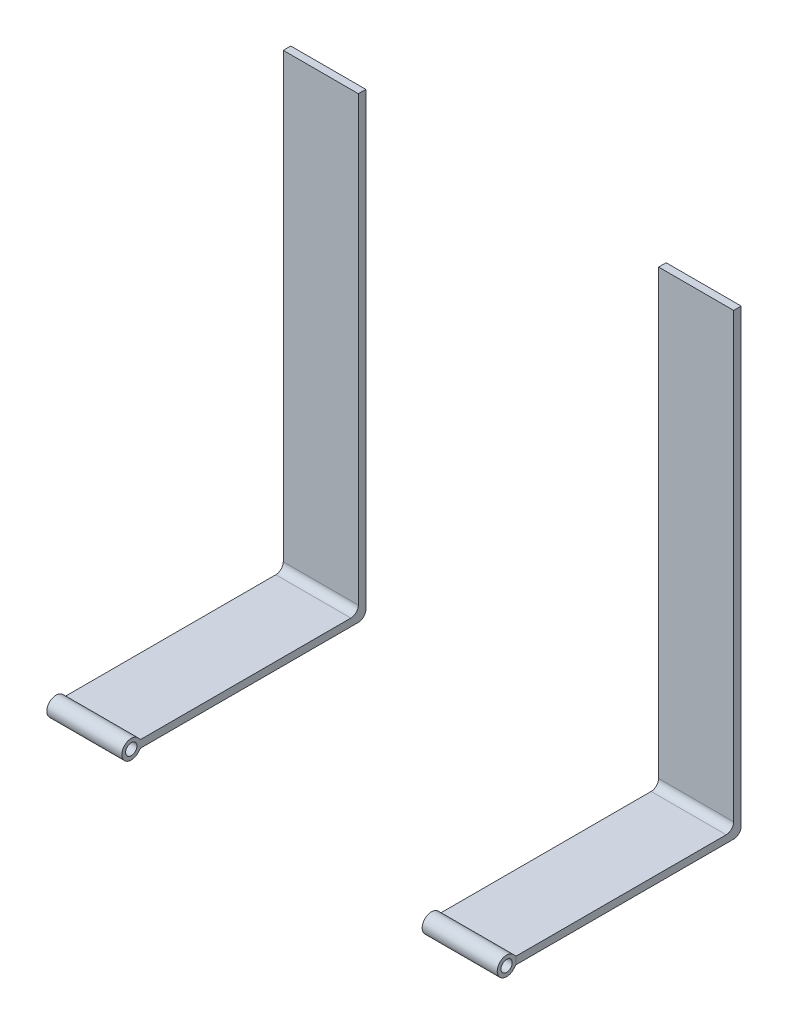
ISO-10303-21;
HEADER;
FILE_DESCRIPTION(('STEP AP214'),'2;1');
FILE_NAME('part.step','',(''),(''),'','','');
FILE_SCHEMA(('AUTOMOTIVE_DESIGN { 1 0 10303 214 1 1 1 1 }'));
ENDSEC;
DATA;
#1=APPLICATION_CONTEXT('core data for automotive mechanical design processes');
#2=APPLICATION_PROTOCOL_DEFINITION('international standard','automotive_design',2000,#1);
#3=PRODUCT_CONTEXT('',#1,'mechanical');
#4=PRODUCT('Part','Part','',(#3));
#5=PRODUCT_RELATED_PRODUCT_CATEGORY('part','',(#4));
#6=PRODUCT_DEFINITION_FORMATION('','',#4);
#7=PRODUCT_DEFINITION_CONTEXT('part definition',#1,'design');
#8=PRODUCT_DEFINITION('design','',#6,#7);
#9=PRODUCT_DEFINITION_SHAPE('','',#8);
#10=(LENGTH_UNIT() NAMED_UNIT(*) SI_UNIT(.MILLI.,.METRE.));
#11=(NAMED_UNIT(*) PLANE_ANGLE_UNIT() SI_UNIT($,.RADIAN.));
#12=(NAMED_UNIT(*) SI_UNIT($,.STERADIAN.) SOLID_ANGLE_UNIT());
#13=UNCERTAINTY_MEASURE_WITH_UNIT(LENGTH_MEASURE(1.E-05),#10,'distance_accuracy_value','');
#14=(GEOMETRIC_REPRESENTATION_CONTEXT(3) GLOBAL_UNCERTAINTY_ASSIGNED_CONTEXT((#13)) GLOBAL_UNIT_ASSIGNED_CONTEXT((#10,
#11,#12)) REPRESENTATION_CONTEXT('',''));
#15=CARTESIAN_POINT('',(0.,0.,0.));
#16=DIRECTION('',(0.,0.,1.));
#17=DIRECTION('',(1.,0.,0.));
#18=AXIS2_PLACEMENT_3D('',#15,#16,#17);
#19=CARTESIAN_POINT('',(-41.8197438789309,1.27,-98.425));
#20=DIRECTION('',(-1.,0.,0.));
#21=DIRECTION('',(0.,0.,1.));
#22=AXIS2_PLACEMENT_3D('',#19,#20,#21);
#23=CYLINDRICAL_SURFACE('',#22,1.90500000000001);
#24=CARTESIAN_POINT('',(-50.8,1.27,-98.425));
#25=DIRECTION('',(-1.,0.,0.));
#26=DIRECTION('',(0.,0.,1.));
#27=AXIS2_PLACEMENT_3D('',#24,#25,#26);
#28=CIRCLE('',#27,1.90500000000001);
#29=CARTESIAN_POINT('',(-50.8,1.27,-96.52));
#30=VERTEX_POINT('',#29);
#31=EDGE_CURVE('E178',#30,#30,#28,.F.);
#32=ORIENTED_EDGE('',*,*,#31,.T.);
#33=EDGE_LOOP('',(#32));
#34=FACE_BOUND('',#33,.T.);
#35=CARTESIAN_POINT('',(-76.2,1.27,-98.425));
#36=DIRECTION('',(-1.,0.,0.));
#37=DIRECTION('',(0.,0.,1.));
#38=AXIS2_PLACEMENT_3D('',#35,#36,#37);
#39=CIRCLE('',#38,1.90500000000001);
#40=CARTESIAN_POINT('',(-76.2,1.27,-96.52));
#41=VERTEX_POINT('',#40);
#42=EDGE_CURVE('E175',#41,#41,#39,.T.);
#43=ORIENTED_EDGE('',*,*,#42,.T.);
#44=EDGE_LOOP('',(#43));
#45=FACE_BOUND('',#44,.T.);
#46=ADVANCED_FACE('F44',(#34,#45),#23,.F.);
#47=CARTESIAN_POINT('',(-41.8197438789308,51.9476813317479,-54.5450653983359));
#48=DIRECTION('',(0.,-0.689655172413789,0.724137931034486));
#49=DIRECTION('',(0.,-0.724137931034486,-0.689655172413789));
#50=AXIS2_PLACEMENT_3D('',#47,#48,#49);
#51=PLANE('',#50);
#52=DIRECTION('',(-1.,0.,0.));
#53=VECTOR('',#52,1.);
#54=CARTESIAN_POINT('',(-41.8197438789308,3.45965517241379,-100.724137931035));
#55=LINE('',#54,#53);
#56=CARTESIAN_POINT('',(-50.8,3.45965517241379,-100.724137931035));
#57=VERTEX_POINT('',#56);
#58=CARTESIAN_POINT('',(-76.2,3.45965517241379,-100.724137931035));
#59=VERTEX_POINT('',#58);
#60=EDGE_CURVE('E48',#57,#59,#55,.T.);
#61=ORIENTED_EDGE('',*,*,#60,.F.);
#62=DIRECTION('',(0.,-0.724137931034486,-0.689655172413789));
#63=VECTOR('',#62,1.);
#64=CARTESIAN_POINT('',(-50.8,51.9476813317479,-54.5450653983359));
#65=LINE('',#64,#63);
#66=CARTESIAN_POINT('',(-50.8,2.54000000000002,-101.6));
#67=VERTEX_POINT('',#66);
#68=EDGE_CURVE('E61',#57,#67,#65,.T.);
#69=ORIENTED_EDGE('',*,*,#68,.T.);
#70=DIRECTION('',(-1.,0.,0.));
#71=VECTOR('',#70,1.);
#72=CARTESIAN_POINT('',(-76.2,2.54,-101.6));
#73=LINE('',#72,#71);
#74=CARTESIAN_POINT('',(-76.2,2.54000000000002,-101.6));
#75=VERTEX_POINT('',#74);
#76=EDGE_CURVE('E172',#67,#75,#73,.T.);
#77=ORIENTED_EDGE('',*,*,#76,.T.);
#78=DIRECTION('',(0.,0.724137931034486,0.689655172413789));
#79=VECTOR('',#78,1.);
#80=CARTESIAN_POINT('',(-76.2,51.9476813317479,-54.5450653983358));
#81=LINE('',#80,#79);
#82=EDGE_CURVE('E168',#75,#59,#81,.T.);
#83=ORIENTED_EDGE('',*,*,#82,.T.);
#84=EDGE_LOOP('',(#61,#69,#77,#83));
#85=FACE_BOUND('',#84,.T.);
#86=ADVANCED_FACE('F46',(#85),#51,.F.);
#87=CARTESIAN_POINT('',(-41.8197438789308,-50.7395957193817,-53.2765755053506));
#88=DIRECTION('',(0.,-0.689655172413794,-0.724137931034482));
#89=DIRECTION('',(0.,0.724137931034482,-0.689655172413794));
#90=AXIS2_PLACEMENT_3D('',#87,#88,#89);
#91=PLANE('',#90);
#92=DIRECTION('',(0.,0.724137931034482,-0.689655172413794));
#93=VECTOR('',#92,1.);
#94=CARTESIAN_POINT('',(-50.8,-50.7395957193817,-53.2765755053506));
#95=LINE('',#94,#93);
#96=CARTESIAN_POINT('',(-50.8,-0.919655172413781,-100.724137931035));
#97=VERTEX_POINT('',#96);
#98=CARTESIAN_POINT('',(-50.8,0.,-101.6));
#99=VERTEX_POINT('',#98);
#100=EDGE_CURVE('E12',#97,#99,#95,.T.);
#101=ORIENTED_EDGE('',*,*,#100,.F.);
#102=DIRECTION('',(-1.,0.,0.));
#103=VECTOR('',#102,1.);
#104=CARTESIAN_POINT('',(-41.8197438789308,-0.919655172413782,-100.724137931035));
#105=LINE('',#104,#103);
#106=CARTESIAN_POINT('',(-76.2,-0.919655172413782,-100.724137931035));
#107=VERTEX_POINT('',#106);
#108=EDGE_CURVE('E171',#97,#107,#105,.T.);
#109=ORIENTED_EDGE('',*,*,#108,.T.);
#110=DIRECTION('',(0.,-0.724137931034482,0.689655172413794));
#111=VECTOR('',#110,1.);
#112=CARTESIAN_POINT('',(-76.2,-50.7395957193817,-53.2765755053506));
#113=LINE('',#112,#111);
#114=CARTESIAN_POINT('',(-76.2,0.,-101.6));
#115=VERTEX_POINT('',#114);
#116=EDGE_CURVE('E129',#115,#107,#113,.T.);
#117=ORIENTED_EDGE('',*,*,#116,.F.);
#118=DIRECTION('',(-1.,0.,0.));
#119=VECTOR('',#118,1.);
#120=CARTESIAN_POINT('',(264.16,0.,-101.6));
#121=LINE('',#120,#119);
#122=EDGE_CURVE('E126',#99,#115,#121,.T.);
#123=ORIENTED_EDGE('',*,*,#122,.F.);
#124=EDGE_LOOP('',(#101,#109,#117,#123));
#125=FACE_BOUND('',#124,.T.);
#126=ADVANCED_FACE('F127',(#125),#91,.T.);
#127=CARTESIAN_POINT('',(-41.8197438789309,1.27,-98.425));
#128=DIRECTION('',(-1.,0.,0.));
#129=DIRECTION('',(0.,0.,1.));
#130=AXIS2_PLACEMENT_3D('',#127,#128,#129);
#131=CYLINDRICAL_SURFACE('',#130,3.175);
#132=ORIENTED_EDGE('',*,*,#108,.F.);
#133=CARTESIAN_POINT('',(-50.8,1.27,-98.425));
#134=DIRECTION('',(-1.,0.,0.));
#135=DIRECTION('',(0.,0.,1.));
#136=AXIS2_PLACEMENT_3D('',#133,#134,#135);
#137=CIRCLE('',#136,3.175);
#138=EDGE_CURVE('E54',#57,#97,#137,.F.);
#139=ORIENTED_EDGE('',*,*,#138,.F.);
#140=ORIENTED_EDGE('',*,*,#60,.T.);
#141=CARTESIAN_POINT('',(-76.2,1.27,-98.425));
#142=DIRECTION('',(-1.,0.,0.));
#143=DIRECTION('',(0.,0.,1.));
#144=AXIS2_PLACEMENT_3D('',#141,#142,#143);
#145=CIRCLE('',#144,3.175);
#146=EDGE_CURVE('E160',#107,#59,#145,.T.);
#147=ORIENTED_EDGE('',*,*,#146,.F.);
#148=EDGE_LOOP('',(#132,#139,#140,#147));
#149=FACE_BOUND('',#148,.T.);
#150=ADVANCED_FACE('F186',(#149),#131,.T.);
#151=CARTESIAN_POINT('',(-50.8,2.54000000000002,-177.8));
#152=DIRECTION('',(-1.,0.,0.));
#153=DIRECTION('',(0.,0.,1.));
#154=AXIS2_PLACEMENT_3D('',#151,#152,#153);
#155=PLANE('',#154);
#156=DIRECTION('',(0.,0.,1.));
#157=VECTOR('',#156,1.);
#158=CARTESIAN_POINT('',(-50.8,2.54000000000002,-177.8));
#159=LINE('',#158,#157);
#160=CARTESIAN_POINT('',(-50.8,2.54000000000002,-172.72));
#161=VERTEX_POINT('',#160);
#162=EDGE_CURVE('E155',#161,#67,#159,.T.);
#163=ORIENTED_EDGE('',*,*,#162,.T.);
#164=ORIENTED_EDGE('',*,*,#68,.F.);
#165=ORIENTED_EDGE('',*,*,#138,.T.);
#166=ORIENTED_EDGE('',*,*,#100,.T.);
#167=DIRECTION('',(0.,0.,1.));
#168=VECTOR('',#167,1.);
#169=CARTESIAN_POINT('',(-50.8,0.,-177.8));
#170=LINE('',#169,#168);
#171=CARTESIAN_POINT('',(-50.8,0.,-175.26));
#172=VERTEX_POINT('',#171);
#173=EDGE_CURVE('E121',#172,#99,#170,.T.);
#174=ORIENTED_EDGE('',*,*,#173,.F.);
#175=CARTESIAN_POINT('',(-50.8,2.54,-175.26));
#176=DIRECTION('',(-1.,0.,0.));
#177=DIRECTION('',(0.,0.,1.));
#178=AXIS2_PLACEMENT_3D('',#175,#176,#177);
#179=CIRCLE('',#178,2.54);
#180=CARTESIAN_POINT('',(-50.8,2.54,-177.8));
#181=VERTEX_POINT('',#180);
#182=EDGE_CURVE('E165',#172,#181,#179,.F.);
#183=ORIENTED_EDGE('',*,*,#182,.T.);
#184=DIRECTION('',(0.,-1.,0.));
#185=VECTOR('',#184,1.);
#186=CARTESIAN_POINT('',(-50.8,2.54000000000002,-177.8));
#187=LINE('',#186,#185);
#188=CARTESIAN_POINT('',(-50.8,154.94,-177.8));
#189=VERTEX_POINT('',#188);
#190=EDGE_CURVE('E159',#189,#181,#187,.T.);
#191=ORIENTED_EDGE('',*,*,#190,.F.);
#192=DIRECTION('',(0.,0.,-1.));
#193=VECTOR('',#192,1.);
#194=CARTESIAN_POINT('',(-50.8,154.94,-177.8));
#195=LINE('',#194,#193);
#196=CARTESIAN_POINT('',(-50.8,154.94,-175.26));
#197=VERTEX_POINT('',#196);
#198=EDGE_CURVE('E225',#197,#189,#195,.T.);
#199=ORIENTED_EDGE('',*,*,#198,.F.);
#200=DIRECTION('',(0.,-1.,0.));
#201=VECTOR('',#200,1.);
#202=CARTESIAN_POINT('',(-50.8,154.94,-175.26));
#203=LINE('',#202,#201);
#204=CARTESIAN_POINT('',(-50.8,5.08000000000006,-175.26));
#205=VERTEX_POINT('',#204);
#206=EDGE_CURVE('E156',#197,#205,#203,.T.);
#207=ORIENTED_EDGE('',*,*,#206,.T.);
#208=CARTESIAN_POINT('',(-50.8,5.08,-172.72));
#209=DIRECTION('',(-1.,0.,0.));
#210=DIRECTION('',(0.,0.,1.));
#211=AXIS2_PLACEMENT_3D('',#208,#209,#210);
#212=CIRCLE('',#211,2.54);
#213=EDGE_CURVE('E153',#205,#161,#212,.T.);
#214=ORIENTED_EDGE('',*,*,#213,.T.);
#215=EDGE_LOOP('',(#163,#164,#165,#166,#174,#183,#191,#199,#207,#214));
#216=FACE_BOUND('',#215,.T.);
#217=ORIENTED_EDGE('',*,*,#31,.F.);
#218=EDGE_LOOP('',(#217));
#219=FACE_BOUND('',#218,.T.);
#220=ADVANCED_FACE('F118',(#216,#219),#155,.F.);
#221=CARTESIAN_POINT('',(0.,2.54,0.));
#222=DIRECTION('',(0.,-1.,0.));
#223=DIRECTION('',(0.,0.,-1.));
#224=AXIS2_PLACEMENT_3D('',#221,#222,#223);
#225=PLANE('',#224);
#226=DIRECTION('',(0.,0.,1.));
#227=VECTOR('',#226,1.);
#228=CARTESIAN_POINT('',(-76.2,2.54000000000002,-177.8));
#229=LINE('',#228,#227);
#230=CARTESIAN_POINT('',(-76.2,2.54000000000002,-172.72));
#231=VERTEX_POINT('',#230);
#232=EDGE_CURVE('E147',#231,#75,#229,.T.);
#233=ORIENTED_EDGE('',*,*,#232,.T.);
#234=ORIENTED_EDGE('',*,*,#76,.F.);
#235=ORIENTED_EDGE('',*,*,#162,.F.);
#236=DIRECTION('',(1.,0.,0.));
#237=VECTOR('',#236,1.);
#238=CARTESIAN_POINT('',(-76.2,2.54,-172.72));
#239=LINE('',#238,#237);
#240=EDGE_CURVE('E134',#161,#231,#239,.F.);
#241=ORIENTED_EDGE('',*,*,#240,.T.);
#242=EDGE_LOOP('',(#233,#234,#235,#241));
#243=FACE_BOUND('',#242,.T.);
#244=ADVANCED_FACE('F212',(#243),#225,.F.);
#245=CARTESIAN_POINT('',(0.,0.,0.));
#246=DIRECTION('',(0.,-1.,0.));
#247=DIRECTION('',(0.,0.,-1.));
#248=AXIS2_PLACEMENT_3D('',#245,#246,#247);
#249=PLANE('',#248);
#250=ORIENTED_EDGE('',*,*,#122,.T.);
#251=DIRECTION('',(0.,0.,1.));
#252=VECTOR('',#251,1.);
#253=CARTESIAN_POINT('',(-76.2,0.,-177.8));
#254=LINE('',#253,#252);
#255=CARTESIAN_POINT('',(-76.2,0.,-175.26));
#256=VERTEX_POINT('',#255);
#257=EDGE_CURVE('E140',#256,#115,#254,.T.);
#258=ORIENTED_EDGE('',*,*,#257,.F.);
#259=DIRECTION('',(-1.,0.,0.));
#260=VECTOR('',#259,1.);
#261=CARTESIAN_POINT('',(0.,0.,-175.26));
#262=LINE('',#261,#260);
#263=EDGE_CURVE('E133',#256,#172,#262,.F.);
#264=ORIENTED_EDGE('',*,*,#263,.T.);
#265=ORIENTED_EDGE('',*,*,#173,.T.);
#266=EDGE_LOOP('',(#250,#258,#264,#265));
#267=FACE_BOUND('',#266,.T.);
#268=ADVANCED_FACE('F136',(#267),#249,.T.);
#269=CARTESIAN_POINT('',(-76.2,2.54000000000002,-177.8));
#270=DIRECTION('',(1.,0.,0.));
#271=DIRECTION('',(0.,0.,-1.));
#272=AXIS2_PLACEMENT_3D('',#269,#270,#271);
#273=PLANE('',#272);
#274=DIRECTION('',(0.,1.,0.));
#275=VECTOR('',#274,1.);
#276=CARTESIAN_POINT('',(-76.2,2.54000000000002,-177.8));
#277=LINE('',#276,#275);
#278=CARTESIAN_POINT('',(-76.2,2.54,-177.8));
#279=VERTEX_POINT('',#278);
#280=CARTESIAN_POINT('',(-76.2,154.94,-177.8));
#281=VERTEX_POINT('',#280);
#282=EDGE_CURVE('E163',#279,#281,#277,.T.);
#283=ORIENTED_EDGE('',*,*,#282,.F.);
#284=CARTESIAN_POINT('',(-76.2,2.54,-175.26));
#285=DIRECTION('',(1.,0.,0.));
#286=DIRECTION('',(0.,0.,-1.));
#287=AXIS2_PLACEMENT_3D('',#284,#285,#286);
#288=CIRCLE('',#287,2.54);
#289=EDGE_CURVE('E138',#279,#256,#288,.F.);
#290=ORIENTED_EDGE('',*,*,#289,.T.);
#291=ORIENTED_EDGE('',*,*,#257,.T.);
#292=ORIENTED_EDGE('',*,*,#116,.T.);
#293=ORIENTED_EDGE('',*,*,#146,.T.);
#294=ORIENTED_EDGE('',*,*,#82,.F.);
#295=ORIENTED_EDGE('',*,*,#232,.F.);
#296=CARTESIAN_POINT('',(-76.2,5.08,-172.72));
#297=DIRECTION('',(1.,0.,0.));
#298=DIRECTION('',(0.,0.,-1.));
#299=AXIS2_PLACEMENT_3D('',#296,#297,#298);
#300=CIRCLE('',#299,2.54);
#301=CARTESIAN_POINT('',(-76.2,5.08000000000006,-175.26));
#302=VERTEX_POINT('',#301);
#303=EDGE_CURVE('E157',#231,#302,#300,.T.);
#304=ORIENTED_EDGE('',*,*,#303,.T.);
#305=DIRECTION('',(0.,-1.,0.));
#306=VECTOR('',#305,1.);
#307=CARTESIAN_POINT('',(-76.2,154.94,-175.26));
#308=LINE('',#307,#306);
#309=CARTESIAN_POINT('',(-76.2,154.94,-175.26));
#310=VERTEX_POINT('',#309);
#311=EDGE_CURVE('E152',#310,#302,#308,.T.);
#312=ORIENTED_EDGE('',*,*,#311,.F.);
#313=DIRECTION('',(0.,0.,1.));
#314=VECTOR('',#313,1.);
#315=CARTESIAN_POINT('',(-76.2,154.94,-177.8));
#316=LINE('',#315,#314);
#317=EDGE_CURVE('E151',#281,#310,#316,.T.);
#318=ORIENTED_EDGE('',*,*,#317,.F.);
#319=EDGE_LOOP('',(#283,#290,#291,#292,#293,#294,#295,#304,#312,#318));
#320=FACE_BOUND('',#319,.T.);
#321=ORIENTED_EDGE('',*,*,#42,.F.);
#322=EDGE_LOOP('',(#321));
#323=FACE_BOUND('',#322,.T.);
#324=ADVANCED_FACE('F194',(#320,#323),#273,.F.);
#325=CARTESIAN_POINT('',(0.,0.,-177.8));
#326=DIRECTION('',(0.,0.,-1.));
#327=DIRECTION('',(-1.,0.,0.));
#328=AXIS2_PLACEMENT_3D('',#325,#326,#327);
#329=PLANE('',#328);
#330=ORIENTED_EDGE('',*,*,#190,.T.);
#331=DIRECTION('',(-1.,0.,0.));
#332=VECTOR('',#331,1.);
#333=CARTESIAN_POINT('',(0.,2.54,-177.8));
#334=LINE('',#333,#332);
#335=EDGE_CURVE('E161',#181,#279,#334,.T.);
#336=ORIENTED_EDGE('',*,*,#335,.T.);
#337=ORIENTED_EDGE('',*,*,#282,.T.);
#338=DIRECTION('',(-1.,0.,0.));
#339=VECTOR('',#338,1.);
#340=CARTESIAN_POINT('',(-76.2,154.94,-177.8));
#341=LINE('',#340,#339);
#342=EDGE_CURVE('E182',#189,#281,#341,.T.);
#343=ORIENTED_EDGE('',*,*,#342,.F.);
#344=EDGE_LOOP('',(#330,#336,#337,#343));
#345=FACE_BOUND('',#344,.T.);
#346=ADVANCED_FACE('F204',(#345),#329,.T.);
#347=CARTESIAN_POINT('',(-76.2,154.94,-175.26));
#348=DIRECTION('',(0.,0.,-1.));
#349=DIRECTION('',(-1.,0.,0.));
#350=AXIS2_PLACEMENT_3D('',#347,#348,#349);
#351=PLANE('',#350);
#352=ORIENTED_EDGE('',*,*,#311,.T.);
#353=DIRECTION('',(1.,0.,0.));
#354=VECTOR('',#353,1.);
#355=CARTESIAN_POINT('',(-50.8,5.08,-175.26));
#356=LINE('',#355,#354);
#357=EDGE_CURVE('E148',#302,#205,#356,.T.);
#358=ORIENTED_EDGE('',*,*,#357,.T.);
#359=ORIENTED_EDGE('',*,*,#206,.F.);
#360=DIRECTION('',(1.,0.,0.));
#361=VECTOR('',#360,1.);
#362=CARTESIAN_POINT('',(-76.2,154.94,-175.26));
#363=LINE('',#362,#361);
#364=EDGE_CURVE('E229',#310,#197,#363,.T.);
#365=ORIENTED_EDGE('',*,*,#364,.F.);
#366=EDGE_LOOP('',(#352,#358,#359,#365));
#367=FACE_BOUND('',#366,.T.);
#368=ADVANCED_FACE('F224',(#367),#351,.F.);
#369=CARTESIAN_POINT('',(0.,154.94,0.));
#370=DIRECTION('',(0.,1.,0.));
#371=DIRECTION('',(0.,0.,1.));
#372=AXIS2_PLACEMENT_3D('',#369,#370,#371);
#373=PLANE('',#372);
#374=ORIENTED_EDGE('',*,*,#317,.T.);
#375=ORIENTED_EDGE('',*,*,#364,.T.);
#376=ORIENTED_EDGE('',*,*,#198,.T.);
#377=ORIENTED_EDGE('',*,*,#342,.T.);
#378=EDGE_LOOP('',(#374,#375,#376,#377));
#379=FACE_BOUND('',#378,.T.);
#380=ADVANCED_FACE('F235',(#379),#373,.T.);
#381=CARTESIAN_POINT('',(-76.2,5.08,-172.72));
#382=DIRECTION('',(-1.,0.,0.));
#383=DIRECTION('',(0.,0.,1.));
#384=AXIS2_PLACEMENT_3D('',#381,#382,#383);
#385=CYLINDRICAL_SURFACE('',#384,2.54);
#386=ORIENTED_EDGE('',*,*,#303,.F.);
#387=ORIENTED_EDGE('',*,*,#240,.F.);
#388=ORIENTED_EDGE('',*,*,#213,.F.);
#389=ORIENTED_EDGE('',*,*,#357,.F.);
#390=EDGE_LOOP('',(#386,#387,#388,#389));
#391=FACE_BOUND('',#390,.T.);
#392=ADVANCED_FACE('F220',(#391),#385,.F.);
#393=CARTESIAN_POINT('',(0.,2.54,-175.26));
#394=DIRECTION('',(-1.,0.,0.));
#395=DIRECTION('',(0.,0.,1.));
#396=AXIS2_PLACEMENT_3D('',#393,#394,#395);
#397=CYLINDRICAL_SURFACE('',#396,2.54);
#398=ORIENTED_EDGE('',*,*,#182,.F.);
#399=ORIENTED_EDGE('',*,*,#263,.F.);
#400=ORIENTED_EDGE('',*,*,#289,.F.);
#401=ORIENTED_EDGE('',*,*,#335,.F.);
#402=EDGE_LOOP('',(#398,#399,#400,#401));
#403=FACE_BOUND('',#402,.T.);
#404=ADVANCED_FACE('F197',(#403),#397,.T.);
#405=CLOSED_SHELL('',(#46,#86,#126,#150,#220,#244,#268,#324,#346,#368,#380,#392,#404));
#406=MANIFOLD_SOLID_BREP('B2',#405);
#407=CARTESIAN_POINT('',(-41.8197438789309,1.27,-98.425));
#408=DIRECTION('',(-1.,0.,0.));
#409=DIRECTION('',(0.,0.,1.));
#410=AXIS2_PLACEMENT_3D('',#407,#408,#409);
#411=CYLINDRICAL_SURFACE('',#410,1.90500000000001);
#412=CARTESIAN_POINT('',(50.8,1.27,-98.4250000000001));
#413=DIRECTION('',(1.,0.,0.));
#414=DIRECTION('',(0.,0.,-1.));
#415=AXIS2_PLACEMENT_3D('',#412,#413,#414);
#416=CIRCLE('',#415,1.90500000000001);
#417=CARTESIAN_POINT('',(50.8,1.27,-100.33));
#418=VERTEX_POINT('',#417);
#419=EDGE_CURVE('E475',#418,#418,#416,.F.);
#420=ORIENTED_EDGE('',*,*,#419,.T.);
#421=EDGE_LOOP('',(#420));
#422=FACE_BOUND('',#421,.T.);
#423=CARTESIAN_POINT('',(76.2,1.27,-98.425));
#424=DIRECTION('',(-1.,0.,0.));
#425=DIRECTION('',(0.,0.,1.));
#426=AXIS2_PLACEMENT_3D('',#423,#424,#425);
#427=CIRCLE('',#426,1.90500000000001);
#428=CARTESIAN_POINT('',(76.2,1.27,-96.52));
#429=VERTEX_POINT('',#428);
#430=EDGE_CURVE('E459',#429,#429,#427,.T.);
#431=ORIENTED_EDGE('',*,*,#430,.F.);
#432=EDGE_LOOP('',(#431));
#433=FACE_BOUND('',#432,.T.);
#434=ADVANCED_FACE('F402',(#422,#433),#411,.F.);
#435=CARTESIAN_POINT('',(76.2,0.,0.));
#436=DIRECTION('',(1.,0.,0.));
#437=DIRECTION('',(0.,0.,1.));
#438=AXIS2_PLACEMENT_3D('',#435,#436,#437);
#439=PLANE('',#438);
#440=ORIENTED_EDGE('',*,*,#430,.T.);
#441=EDGE_LOOP('',(#440));
#442=FACE_BOUND('',#441,.T.);
#443=CARTESIAN_POINT('',(76.2,1.27,-98.425));
#444=DIRECTION('',(-1.,0.,0.));
#445=DIRECTION('',(0.,0.,1.));
#446=AXIS2_PLACEMENT_3D('',#443,#444,#445);
#447=CIRCLE('',#446,3.175);
#448=CARTESIAN_POINT('',(76.2,-0.919655172413782,-100.724137931035));
#449=VERTEX_POINT('',#448);
#450=CARTESIAN_POINT('',(76.2,3.45965517241379,-100.724137931035));
#451=VERTEX_POINT('',#450);
#452=EDGE_CURVE('E461',#449,#451,#447,.T.);
#453=ORIENTED_EDGE('',*,*,#452,.F.);
#454=DIRECTION('',(0.,-0.724137931034482,0.689655172413794));
#455=VECTOR('',#454,1.);
#456=CARTESIAN_POINT('',(76.2,-50.7395957193817,-53.2765755053506));
#457=LINE('',#456,#455);
#458=CARTESIAN_POINT('',(76.2,0.,-101.6));
#459=VERTEX_POINT('',#458);
#460=EDGE_CURVE('E456',#459,#449,#457,.T.);
#461=ORIENTED_EDGE('',*,*,#460,.F.);
#462=DIRECTION('',(0.,1.,0.));
#463=VECTOR('',#462,1.);
#464=CARTESIAN_POINT('',(76.2,0.,-101.6));
#465=LINE('',#464,#463);
#466=CARTESIAN_POINT('',(76.2,2.54000000000002,-101.6));
#467=VERTEX_POINT('',#466);
#468=EDGE_CURVE('E455',#459,#467,#465,.T.);
#469=ORIENTED_EDGE('',*,*,#468,.T.);
#470=DIRECTION('',(0.,0.724137931034486,0.689655172413789));
#471=VECTOR('',#470,1.);
#472=CARTESIAN_POINT('',(76.2,51.9476813317479,-54.5450653983358));
#473=LINE('',#472,#471);
#474=EDGE_CURVE('E467',#467,#451,#473,.T.);
#475=ORIENTED_EDGE('',*,*,#474,.T.);
#476=EDGE_LOOP('',(#453,#461,#469,#475));
#477=FACE_BOUND('',#476,.T.);
#478=ADVANCED_FACE('F481',(#442,#477),#439,.T.);
#479=CARTESIAN_POINT('',(-41.8197438789309,1.27,-98.425));
#480=DIRECTION('',(-1.,0.,0.));
#481=DIRECTION('',(0.,0.,1.));
#482=AXIS2_PLACEMENT_3D('',#479,#480,#481);
#483=CYLINDRICAL_SURFACE('',#482,3.175);
#484=CARTESIAN_POINT('',(50.8,1.27,-98.4250000000001));
#485=DIRECTION('',(1.,0.,0.));
#486=DIRECTION('',(0.,0.,-1.));
#487=AXIS2_PLACEMENT_3D('',#484,#485,#486);
#488=CIRCLE('',#487,3.175);
#489=CARTESIAN_POINT('',(50.8,-0.919655172413788,-100.724137931035));
#490=VERTEX_POINT('',#489);
#491=CARTESIAN_POINT('',(50.8,3.4596551724138,-100.724137931035));
#492=VERTEX_POINT('',#491);
#493=EDGE_CURVE('E450',#490,#492,#488,.F.);
#494=ORIENTED_EDGE('',*,*,#493,.F.);
#495=DIRECTION('',(-1.,0.,0.));
#496=VECTOR('',#495,1.);
#497=CARTESIAN_POINT('',(-41.8197438789308,-0.919655172413782,-100.724137931035));
#498=LINE('',#497,#496);
#499=EDGE_CURVE('E409',#449,#490,#498,.T.);
#500=ORIENTED_EDGE('',*,*,#499,.F.);
#501=ORIENTED_EDGE('',*,*,#452,.T.);
#502=DIRECTION('',(-1.,0.,0.));
#503=VECTOR('',#502,1.);
#504=CARTESIAN_POINT('',(-41.8197438789308,3.45965517241379,-100.724137931035));
#505=LINE('',#504,#503);
#506=EDGE_CURVE('E465',#451,#492,#505,.T.);
#507=ORIENTED_EDGE('',*,*,#506,.T.);
#508=EDGE_LOOP('',(#494,#500,#501,#507));
#509=FACE_BOUND('',#508,.T.);
#510=ADVANCED_FACE('F488',(#509),#483,.T.);
#511=CARTESIAN_POINT('',(-59.7802561210691,0.,-101.6));
#512=DIRECTION('',(0.,0.,-1.));
#513=DIRECTION('',(-1.,0.,0.));
#514=AXIS2_PLACEMENT_3D('',#511,#512,#513);
#515=PLANE('',#514);
#516=DIRECTION('',(0.,-1.,0.));
#517=VECTOR('',#516,1.);
#518=CARTESIAN_POINT('',(50.8,0.,-101.6));
#519=LINE('',#518,#517);
#520=CARTESIAN_POINT('',(50.8,2.54000000000002,-101.6));
#521=VERTEX_POINT('',#520);
#522=CARTESIAN_POINT('',(50.8,0.,-101.6));
#523=VERTEX_POINT('',#522);
#524=EDGE_CURVE('E42',#521,#523,#519,.T.);
#525=ORIENTED_EDGE('',*,*,#524,.F.);
#526=DIRECTION('',(1.,0.,0.));
#527=VECTOR('',#526,1.);
#528=CARTESIAN_POINT('',(-59.7802561210691,2.54000000000002,-101.6));
#529=LINE('',#528,#527);
#530=EDGE_CURVE('E457',#521,#467,#529,.T.);
#531=ORIENTED_EDGE('',*,*,#530,.T.);
#532=ORIENTED_EDGE('',*,*,#468,.F.);
#533=DIRECTION('',(1.,0.,0.));
#534=VECTOR('',#533,1.);
#535=CARTESIAN_POINT('',(-59.7802561210691,0.,-101.6));
#536=LINE('',#535,#534);
#537=EDGE_CURVE('E424',#523,#459,#536,.T.);
#538=ORIENTED_EDGE('',*,*,#537,.F.);
#539=EDGE_LOOP('',(#525,#531,#532,#538));
#540=FACE_BOUND('',#539,.T.);
#541=ADVANCED_FACE('F453',(#540),#515,.T.);
#542=CARTESIAN_POINT('',(-41.8197438789308,-50.7395957193817,-53.2765755053506));
#543=DIRECTION('',(0.,-0.689655172413794,-0.724137931034482));
#544=DIRECTION('',(0.,0.724137931034482,-0.689655172413794));
#545=AXIS2_PLACEMENT_3D('',#542,#543,#544);
#546=PLANE('',#545);
#547=DIRECTION('',(0.,-0.724137931034482,0.689655172413794));
#548=VECTOR('',#547,1.);
#549=CARTESIAN_POINT('',(50.8,-50.7395957193817,-53.2765755053507));
#550=LINE('',#549,#548);
#551=EDGE_CURVE('E441',#523,#490,#550,.T.);
#552=ORIENTED_EDGE('',*,*,#551,.F.);
#553=ORIENTED_EDGE('',*,*,#537,.T.);
#554=ORIENTED_EDGE('',*,*,#460,.T.);
#555=ORIENTED_EDGE('',*,*,#499,.T.);
#556=EDGE_LOOP('',(#552,#553,#554,#555));
#557=FACE_BOUND('',#556,.T.);
#558=ADVANCED_FACE('F449',(#557),#546,.T.);
#559=CARTESIAN_POINT('',(-41.8197438789308,51.9476813317479,-54.5450653983359));
#560=DIRECTION('',(0.,-0.689655172413789,0.724137931034486));
#561=DIRECTION('',(0.,-0.724137931034486,-0.689655172413789));
#562=AXIS2_PLACEMENT_3D('',#559,#560,#561);
#563=PLANE('',#562);
#564=ORIENTED_EDGE('',*,*,#530,.F.);
#565=DIRECTION('',(0.,0.724137931034486,0.689655172413789));
#566=VECTOR('',#565,1.);
#567=CARTESIAN_POINT('',(50.8,51.9476813317479,-54.5450653983359));
#568=LINE('',#567,#566);
#569=EDGE_CURVE('E415',#521,#492,#568,.T.);
#570=ORIENTED_EDGE('',*,*,#569,.T.);
#571=ORIENTED_EDGE('',*,*,#506,.F.);
#572=ORIENTED_EDGE('',*,*,#474,.F.);
#573=EDGE_LOOP('',(#564,#570,#571,#572));
#574=FACE_BOUND('',#573,.T.);
#575=ADVANCED_FACE('F500',(#574),#563,.F.);
#576=CARTESIAN_POINT('',(50.8,-10.16,-101.6));
#577=DIRECTION('',(1.,0.,0.));
#578=DIRECTION('',(0.,0.,-1.));
#579=AXIS2_PLACEMENT_3D('',#576,#577,#578);
#580=PLANE('',#579);
#581=ORIENTED_EDGE('',*,*,#524,.T.);
#582=ORIENTED_EDGE('',*,*,#551,.T.);
#583=ORIENTED_EDGE('',*,*,#493,.T.);
#584=ORIENTED_EDGE('',*,*,#569,.F.);
#585=EDGE_LOOP('',(#581,#582,#583,#584));
#586=FACE_BOUND('',#585,.T.);
#587=ORIENTED_EDGE('',*,*,#419,.F.);
#588=EDGE_LOOP('',(#587));
#589=FACE_BOUND('',#588,.T.);
#590=ADVANCED_FACE('F445',(#586,#589),#580,.F.);
#591=CLOSED_SHELL('',(#434,#478,#510,#541,#558,#575,#590));
#592=MANIFOLD_SOLID_BREP('B6',#591);
#593=CARTESIAN_POINT('',(0.,154.94,0.));
#594=DIRECTION('',(0.,1.,0.));
#595=DIRECTION('',(0.,0.,1.));
#596=AXIS2_PLACEMENT_3D('',#593,#594,#595);
#597=PLANE('',#596);
#598=DIRECTION('',(-1.,0.,0.));
#599=VECTOR('',#598,1.);
#600=CARTESIAN_POINT('',(76.2,154.94,-177.8));
#601=LINE('',#600,#599);
#602=CARTESIAN_POINT('',(76.2,154.94,-177.8));
#603=VERTEX_POINT('',#602);
#604=CARTESIAN_POINT('',(50.8,154.94,-177.8));
#605=VERTEX_POINT('',#604);
#606=EDGE_CURVE('E685',#603,#605,#601,.T.);
#607=ORIENTED_EDGE('',*,*,#606,.T.);
#608=DIRECTION('',(0.,0.,1.));
#609=VECTOR('',#608,1.);
#610=CARTESIAN_POINT('',(50.8,154.94,-177.8));
#611=LINE('',#610,#609);
#612=CARTESIAN_POINT('',(50.8,154.94,-175.26));
#613=VERTEX_POINT('',#612);
#614=EDGE_CURVE('E701',#605,#613,#611,.T.);
#615=ORIENTED_EDGE('',*,*,#614,.T.);
#616=DIRECTION('',(1.,0.,0.));
#617=VECTOR('',#616,1.);
#618=CARTESIAN_POINT('',(76.2,154.94,-175.26));
#619=LINE('',#618,#617);
#620=CARTESIAN_POINT('',(76.2,154.94,-175.26));
#621=VERTEX_POINT('',#620);
#622=EDGE_CURVE('E699',#613,#621,#619,.T.);
#623=ORIENTED_EDGE('',*,*,#622,.T.);
#624=DIRECTION('',(0.,0.,-1.));
#625=VECTOR('',#624,1.);
#626=CARTESIAN_POINT('',(76.2,154.94,-177.8));
#627=LINE('',#626,#625);
#628=EDGE_CURVE('E697',#621,#603,#627,.T.);
#629=ORIENTED_EDGE('',*,*,#628,.T.);
#630=EDGE_LOOP('',(#607,#615,#623,#629));
#631=FACE_BOUND('',#630,.T.);
#632=ADVANCED_FACE('F567',(#631),#597,.T.);
#633=CARTESIAN_POINT('',(76.2,154.94,-175.26));
#634=DIRECTION('',(0.,0.,-1.));
#635=DIRECTION('',(-1.,0.,0.));
#636=AXIS2_PLACEMENT_3D('',#633,#634,#635);
#637=PLANE('',#636);
#638=DIRECTION('',(0.,-1.,0.));
#639=VECTOR('',#638,1.);
#640=CARTESIAN_POINT('',(50.8,154.94,-175.26));
#641=LINE('',#640,#639);
#642=CARTESIAN_POINT('',(50.8,5.08000000000006,-175.26));
#643=VERTEX_POINT('',#642);
#644=EDGE_CURVE('E640',#613,#643,#641,.T.);
#645=ORIENTED_EDGE('',*,*,#644,.T.);
#646=DIRECTION('',(1.,0.,0.));
#647=VECTOR('',#646,1.);
#648=CARTESIAN_POINT('',(76.2,5.08,-175.26));
#649=LINE('',#648,#647);
#650=CARTESIAN_POINT('',(76.2,5.08000000000006,-175.26));
#651=VERTEX_POINT('',#650);
#652=EDGE_CURVE('E654',#643,#651,#649,.T.);
#653=ORIENTED_EDGE('',*,*,#652,.T.);
#654=DIRECTION('',(0.,-1.,0.));
#655=VECTOR('',#654,1.);
#656=CARTESIAN_POINT('',(76.2,154.94,-175.26));
#657=LINE('',#656,#655);
#658=EDGE_CURVE('E695',#621,#651,#657,.T.);
#659=ORIENTED_EDGE('',*,*,#658,.F.);
#660=ORIENTED_EDGE('',*,*,#622,.F.);
#661=EDGE_LOOP('',(#645,#653,#659,#660));
#662=FACE_BOUND('',#661,.T.);
#663=ADVANCED_FACE('F709',(#662),#637,.F.);
#664=CARTESIAN_POINT('',(76.2,5.08,-172.72));
#665=DIRECTION('',(-1.,0.,0.));
#666=DIRECTION('',(0.,0.,1.));
#667=AXIS2_PLACEMENT_3D('',#664,#665,#666);
#668=CYLINDRICAL_SURFACE('',#667,2.54);
#669=CARTESIAN_POINT('',(50.8,5.08,-172.72));
#670=DIRECTION('',(1.,0.,0.));
#671=DIRECTION('',(0.,0.,-1.));
#672=AXIS2_PLACEMENT_3D('',#669,#670,#671);
#673=CIRCLE('',#672,2.54);
#674=CARTESIAN_POINT('',(50.8,2.54000000000002,-172.72));
#675=VERTEX_POINT('',#674);
#676=EDGE_CURVE('E666',#675,#643,#673,.T.);
#677=ORIENTED_EDGE('',*,*,#676,.F.);
#678=DIRECTION('',(1.,0.,0.));
#679=VECTOR('',#678,1.);
#680=CARTESIAN_POINT('',(50.8,2.54,-172.72));
#681=LINE('',#680,#679);
#682=CARTESIAN_POINT('',(76.2,2.54000000000002,-172.72));
#683=VERTEX_POINT('',#682);
#684=EDGE_CURVE('E658',#683,#675,#681,.F.);
#685=ORIENTED_EDGE('',*,*,#684,.F.);
#686=CARTESIAN_POINT('',(76.2,5.08,-172.72));
#687=DIRECTION('',(-1.,0.,0.));
#688=DIRECTION('',(0.,0.,1.));
#689=AXIS2_PLACEMENT_3D('',#686,#687,#688);
#690=CIRCLE('',#689,2.54);
#691=EDGE_CURVE('E653',#651,#683,#690,.T.);
#692=ORIENTED_EDGE('',*,*,#691,.F.);
#693=ORIENTED_EDGE('',*,*,#652,.F.);
#694=EDGE_LOOP('',(#677,#685,#692,#693));
#695=FACE_BOUND('',#694,.T.);
#696=ADVANCED_FACE('F713',(#695),#668,.F.);
#697=CARTESIAN_POINT('',(0.,2.54,-175.26));
#698=DIRECTION('',(-1.,0.,0.));
#699=DIRECTION('',(0.,0.,1.));
#700=AXIS2_PLACEMENT_3D('',#697,#698,#699);
#701=CYLINDRICAL_SURFACE('',#700,2.54);
#702=CARTESIAN_POINT('',(76.2,2.54,-175.26));
#703=DIRECTION('',(-1.,0.,0.));
#704=DIRECTION('',(0.,0.,1.));
#705=AXIS2_PLACEMENT_3D('',#702,#703,#704);
#706=CIRCLE('',#705,2.54);
#707=CARTESIAN_POINT('',(76.2,0.,-175.26));
#708=VERTEX_POINT('',#707);
#709=CARTESIAN_POINT('',(76.2,2.54,-177.8));
#710=VERTEX_POINT('',#709);
#711=EDGE_CURVE('E400',#708,#710,#706,.F.);
#712=ORIENTED_EDGE('',*,*,#711,.F.);
#713=DIRECTION('',(-1.,0.,0.));
#714=VECTOR('',#713,1.);
#715=CARTESIAN_POINT('',(0.,0.,-175.26));
#716=LINE('',#715,#714);
#717=CARTESIAN_POINT('',(50.8,0.,-175.26));
#718=VERTEX_POINT('',#717);
#719=EDGE_CURVE('E668',#718,#708,#716,.F.);
#720=ORIENTED_EDGE('',*,*,#719,.F.);
#721=CARTESIAN_POINT('',(50.8,2.54,-175.26));
#722=DIRECTION('',(1.,0.,0.));
#723=DIRECTION('',(0.,0.,-1.));
#724=AXIS2_PLACEMENT_3D('',#721,#722,#723);
#725=CIRCLE('',#724,2.54);
#726=CARTESIAN_POINT('',(50.8,2.54,-177.8));
#727=VERTEX_POINT('',#726);
#728=EDGE_CURVE('E575',#727,#718,#725,.F.);
#729=ORIENTED_EDGE('',*,*,#728,.F.);
#730=DIRECTION('',(-1.,0.,0.));
#731=VECTOR('',#730,1.);
#732=CARTESIAN_POINT('',(0.,2.54,-177.8));
#733=LINE('',#732,#731);
#734=EDGE_CURVE('E670',#710,#727,#733,.T.);
#735=ORIENTED_EDGE('',*,*,#734,.F.);
#736=EDGE_LOOP('',(#712,#720,#729,#735));
#737=FACE_BOUND('',#736,.T.);
#738=ADVANCED_FACE('F569',(#737),#701,.T.);
#739=CARTESIAN_POINT('',(0.,0.,-177.8));
#740=DIRECTION('',(0.,0.,-1.));
#741=DIRECTION('',(-1.,0.,0.));
#742=AXIS2_PLACEMENT_3D('',#739,#740,#741);
#743=PLANE('',#742);
#744=DIRECTION('',(0.,-1.,0.));
#745=VECTOR('',#744,1.);
#746=CARTESIAN_POINT('',(76.2,2.54000000000002,-177.8));
#747=LINE('',#746,#745);
#748=EDGE_CURVE('E683',#603,#710,#747,.T.);
#749=ORIENTED_EDGE('',*,*,#748,.T.);
#750=ORIENTED_EDGE('',*,*,#734,.T.);
#751=DIRECTION('',(0.,1.,0.));
#752=VECTOR('',#751,1.);
#753=CARTESIAN_POINT('',(50.8,2.54000000000002,-177.8));
#754=LINE('',#753,#752);
#755=EDGE_CURVE('E677',#727,#605,#754,.T.);
#756=ORIENTED_EDGE('',*,*,#755,.T.);
#757=ORIENTED_EDGE('',*,*,#606,.F.);
#758=EDGE_LOOP('',(#749,#750,#756,#757));
#759=FACE_BOUND('',#758,.T.);
#760=ADVANCED_FACE('F681',(#759),#743,.T.);
#761=CARTESIAN_POINT('',(76.2,2.54000000000002,-177.8));
#762=DIRECTION('',(-1.,0.,0.));
#763=DIRECTION('',(0.,0.,1.));
#764=AXIS2_PLACEMENT_3D('',#761,#762,#763);
#765=PLANE('',#764);
#766=DIRECTION('',(0.,0.,1.));
#767=VECTOR('',#766,1.);
#768=CARTESIAN_POINT('',(76.2,0.,-177.8));
#769=LINE('',#768,#767);
#770=CARTESIAN_POINT('',(76.2,0.,-101.6));
#771=VERTEX_POINT('',#770);
#772=EDGE_CURVE('E655',#708,#771,#769,.T.);
#773=ORIENTED_EDGE('',*,*,#772,.F.);
#774=ORIENTED_EDGE('',*,*,#711,.T.);
#775=ORIENTED_EDGE('',*,*,#748,.F.);
#776=ORIENTED_EDGE('',*,*,#628,.F.);
#777=ORIENTED_EDGE('',*,*,#658,.T.);
#778=ORIENTED_EDGE('',*,*,#691,.T.);
#779=DIRECTION('',(0.,0.,1.));
#780=VECTOR('',#779,1.);
#781=CARTESIAN_POINT('',(76.2,2.54000000000002,-177.8));
#782=LINE('',#781,#780);
#783=CARTESIAN_POINT('',(76.1999999999999,2.54,-101.6));
#784=VERTEX_POINT('',#783);
#785=EDGE_CURVE('E645',#683,#784,#782,.T.);
#786=ORIENTED_EDGE('',*,*,#785,.T.);
#787=DIRECTION('',(0.,-1.,0.));
#788=VECTOR('',#787,1.);
#789=CARTESIAN_POINT('',(76.2,2.54000000000002,-101.6));
#790=LINE('',#789,#788);
#791=EDGE_CURVE('E630',#784,#771,#790,.T.);
#792=ORIENTED_EDGE('',*,*,#791,.T.);
#793=EDGE_LOOP('',(#773,#774,#775,#776,#777,#778,#786,#792));
#794=FACE_BOUND('',#793,.T.);
#795=ADVANCED_FACE('F651',(#794),#765,.F.);
#796=CARTESIAN_POINT('',(50.8,2.54000000000002,-177.8));
#797=DIRECTION('',(1.,0.,0.));
#798=DIRECTION('',(0.,0.,-1.));
#799=AXIS2_PLACEMENT_3D('',#796,#797,#798);
#800=PLANE('',#799);
#801=ORIENTED_EDGE('',*,*,#755,.F.);
#802=ORIENTED_EDGE('',*,*,#728,.T.);
#803=DIRECTION('',(0.,0.,1.));
#804=VECTOR('',#803,1.);
#805=CARTESIAN_POINT('',(50.8,0.,-177.8));
#806=LINE('',#805,#804);
#807=CARTESIAN_POINT('',(50.8,0.,-101.6));
#808=VERTEX_POINT('',#807);
#809=EDGE_CURVE('E660',#718,#808,#806,.T.);
#810=ORIENTED_EDGE('',*,*,#809,.T.);
#811=DIRECTION('',(0.,1.,0.));
#812=VECTOR('',#811,1.);
#813=CARTESIAN_POINT('',(50.8,2.54000000000002,-101.6));
#814=LINE('',#813,#812);
#815=CARTESIAN_POINT('',(50.8,2.54,-101.6));
#816=VERTEX_POINT('',#815);
#817=EDGE_CURVE('E639',#808,#816,#814,.T.);
#818=ORIENTED_EDGE('',*,*,#817,.T.);
#819=DIRECTION('',(0.,0.,1.));
#820=VECTOR('',#819,1.);
#821=CARTESIAN_POINT('',(50.8,2.54000000000002,-177.8));
#822=LINE('',#821,#820);
#823=EDGE_CURVE('E648',#675,#816,#822,.T.);
#824=ORIENTED_EDGE('',*,*,#823,.F.);
#825=ORIENTED_EDGE('',*,*,#676,.T.);
#826=ORIENTED_EDGE('',*,*,#644,.F.);
#827=ORIENTED_EDGE('',*,*,#614,.F.);
#828=EDGE_LOOP('',(#801,#802,#810,#818,#824,#825,#826,#827));
#829=FACE_BOUND('',#828,.T.);
#830=ADVANCED_FACE('F675',(#829),#800,.F.);
#831=CARTESIAN_POINT('',(0.,0.,0.));
#832=DIRECTION('',(0.,-1.,0.));
#833=DIRECTION('',(0.,0.,-1.));
#834=AXIS2_PLACEMENT_3D('',#831,#832,#833);
#835=PLANE('',#834);
#836=DIRECTION('',(-1.,0.,0.));
#837=VECTOR('',#836,1.);
#838=CARTESIAN_POINT('',(264.16,0.,-101.6));
#839=LINE('',#838,#837);
#840=EDGE_CURVE('E636',#771,#808,#839,.T.);
#841=ORIENTED_EDGE('',*,*,#840,.T.);
#842=ORIENTED_EDGE('',*,*,#809,.F.);
#843=ORIENTED_EDGE('',*,*,#719,.T.);
#844=ORIENTED_EDGE('',*,*,#772,.T.);
#845=EDGE_LOOP('',(#841,#842,#843,#844));
#846=FACE_BOUND('',#845,.T.);
#847=ADVANCED_FACE('F679',(#846),#835,.T.);
#848=CARTESIAN_POINT('',(0.,2.54,0.));
#849=DIRECTION('',(0.,-1.,0.));
#850=DIRECTION('',(0.,0.,-1.));
#851=AXIS2_PLACEMENT_3D('',#848,#849,#850);
#852=PLANE('',#851);
#853=ORIENTED_EDGE('',*,*,#823,.T.);
#854=DIRECTION('',(-1.,0.,0.));
#855=VECTOR('',#854,1.);
#856=CARTESIAN_POINT('',(-76.2,2.54,-101.6));
#857=LINE('',#856,#855);
#858=EDGE_CURVE('E633',#784,#816,#857,.T.);
#859=ORIENTED_EDGE('',*,*,#858,.F.);
#860=ORIENTED_EDGE('',*,*,#785,.F.);
#861=ORIENTED_EDGE('',*,*,#684,.T.);
#862=EDGE_LOOP('',(#853,#859,#860,#861));
#863=FACE_BOUND('',#862,.T.);
#864=ADVANCED_FACE('F644',(#863),#852,.F.);
#865=CARTESIAN_POINT('',(-76.2,0.,-101.6));
#866=DIRECTION('',(0.,0.,-1.));
#867=DIRECTION('',(-1.,0.,0.));
#868=AXIS2_PLACEMENT_3D('',#865,#866,#867);
#869=PLANE('',#868);
#870=ORIENTED_EDGE('',*,*,#858,.T.);
#871=ORIENTED_EDGE('',*,*,#817,.F.);
#872=ORIENTED_EDGE('',*,*,#840,.F.);
#873=ORIENTED_EDGE('',*,*,#791,.F.);
#874=EDGE_LOOP('',(#870,#871,#872,#873));
#875=FACE_BOUND('',#874,.T.);
#876=ADVANCED_FACE('F632',(#875),#869,.F.);
#877=CLOSED_SHELL('',(#632,#663,#696,#738,#760,#795,#830,#847,#864,#876));
#878=MANIFOLD_SOLID_BREP('B36',#877);
#879=ADVANCED_BREP_SHAPE_REPRESENTATION('',(#18,#406,#592,#878),#14);
#880=SHAPE_DEFINITION_REPRESENTATION(#9,#879);
ENDSEC;
END-ISO-10303-21;
